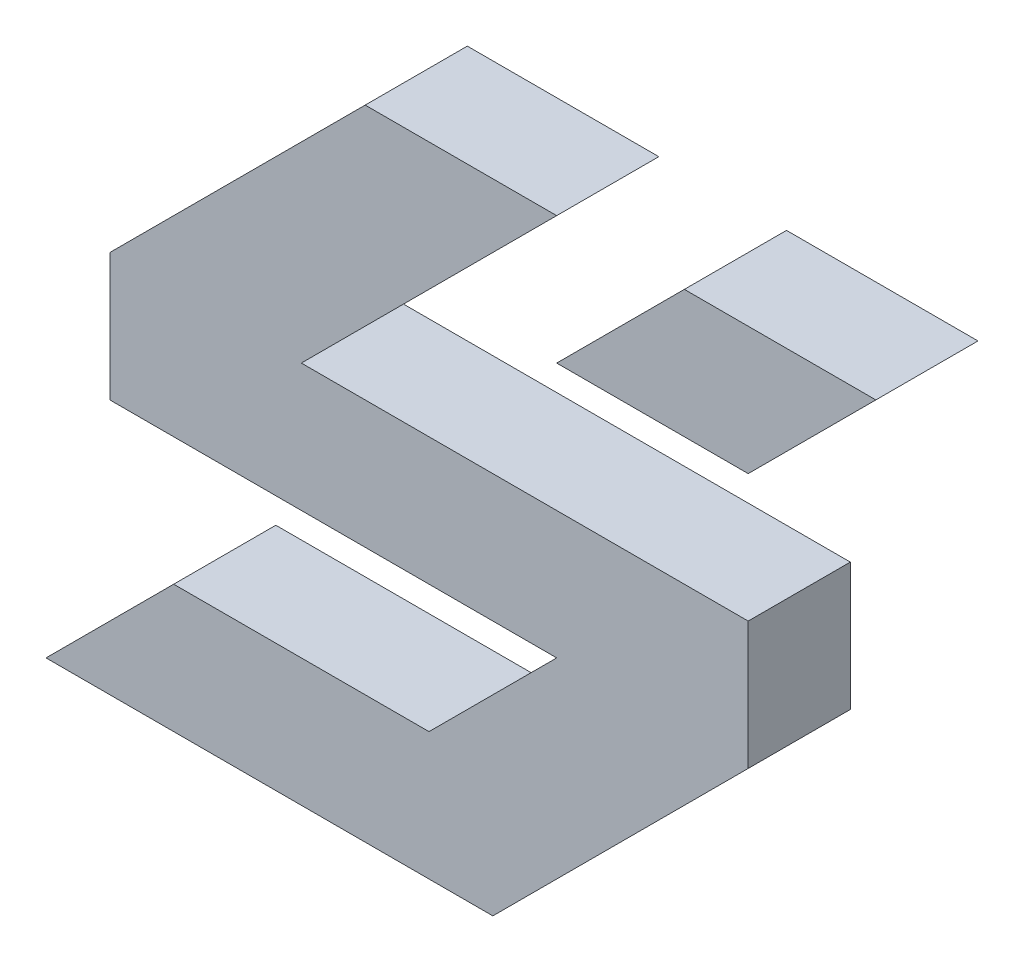
ISO-10303-21;
HEADER;
FILE_DESCRIPTION(('STEP AP214'),'2;1');
FILE_NAME('part.step','',(''),(''),'','','');
FILE_SCHEMA(('AUTOMOTIVE_DESIGN { 1 0 10303 214 1 1 1 1 }'));
ENDSEC;
DATA;
#1=APPLICATION_CONTEXT('core data for automotive mechanical design processes');
#2=APPLICATION_PROTOCOL_DEFINITION('international standard','automotive_design',2000,#1);
#3=PRODUCT_CONTEXT('',#1,'mechanical');
#4=PRODUCT('Part','Part','',(#3));
#5=PRODUCT_RELATED_PRODUCT_CATEGORY('part','',(#4));
#6=PRODUCT_DEFINITION_FORMATION('','',#4);
#7=PRODUCT_DEFINITION_CONTEXT('part definition',#1,'design');
#8=PRODUCT_DEFINITION('design','',#6,#7);
#9=PRODUCT_DEFINITION_SHAPE('','',#8);
#10=(LENGTH_UNIT() NAMED_UNIT(*) SI_UNIT(.MILLI.,.METRE.));
#11=(NAMED_UNIT(*) PLANE_ANGLE_UNIT() SI_UNIT($,.RADIAN.));
#12=(NAMED_UNIT(*) SI_UNIT($,.STERADIAN.) SOLID_ANGLE_UNIT());
#13=UNCERTAINTY_MEASURE_WITH_UNIT(LENGTH_MEASURE(1.E-05),#10,'distance_accuracy_value','');
#14=(GEOMETRIC_REPRESENTATION_CONTEXT(3) GLOBAL_UNCERTAINTY_ASSIGNED_CONTEXT((#13)) GLOBAL_UNIT_ASSIGNED_CONTEXT((#10,
#11,#12)) REPRESENTATION_CONTEXT('',''));
#15=CARTESIAN_POINT('',(0.,0.,0.));
#16=DIRECTION('',(0.,0.,1.));
#17=DIRECTION('',(1.,0.,0.));
#18=AXIS2_PLACEMENT_3D('',#15,#16,#17);
#19=CARTESIAN_POINT('',(0.,0.,10.));
#20=DIRECTION('',(-0.707106781186549,0.707106781186546,0.));
#21=DIRECTION('',(-0.707106781186546,-0.707106781186549,0.));
#22=AXIS2_PLACEMENT_3D('',#19,#20,#21);
#23=PLANE('',#22);
#24=DIRECTION('',(0.707106781186546,0.707106781186549,0.));
#25=VECTOR('',#24,1.);
#26=CARTESIAN_POINT('',(0.,0.,0.));
#27=LINE('',#26,#25);
#28=CARTESIAN_POINT('',(37.4999999999998,37.5,0.));
#29=VERTEX_POINT('',#28);
#30=CARTESIAN_POINT('',(62.4999999999998,62.5,0.));
#31=VERTEX_POINT('',#30);
#32=EDGE_CURVE('E224',#29,#31,#27,.T.);
#33=ORIENTED_EDGE('',*,*,#32,.F.);
#34=DIRECTION('',(0.,0.,-1.));
#35=VECTOR('',#34,1.);
#36=CARTESIAN_POINT('',(37.4999999999998,37.5,10.));
#37=LINE('',#36,#35);
#38=CARTESIAN_POINT('',(37.4999999999998,37.5,10.));
#39=VERTEX_POINT('',#38);
#40=EDGE_CURVE('E13',#39,#29,#37,.T.);
#41=ORIENTED_EDGE('',*,*,#40,.F.);
#42=DIRECTION('',(0.707106781186546,0.707106781186549,0.));
#43=VECTOR('',#42,1.);
#44=CARTESIAN_POINT('',(0.,0.,10.));
#45=LINE('',#44,#43);
#46=CARTESIAN_POINT('',(62.4999999999998,62.5,10.));
#47=VERTEX_POINT('',#46);
#48=EDGE_CURVE('E264',#39,#47,#45,.T.);
#49=ORIENTED_EDGE('',*,*,#48,.T.);
#50=DIRECTION('',(0.,0.,-1.));
#51=VECTOR('',#50,1.);
#52=CARTESIAN_POINT('',(62.4999999999998,62.5,10.));
#53=LINE('',#52,#51);
#54=EDGE_CURVE('E116',#47,#31,#53,.T.);
#55=ORIENTED_EDGE('',*,*,#54,.T.);
#56=EDGE_LOOP('',(#33,#41,#49,#55));
#57=FACE_BOUND('',#56,.T.);
#58=ADVANCED_FACE('F99',(#57),#23,.T.);
#59=CARTESIAN_POINT('',(37.4999999999999,0.,10.));
#60=DIRECTION('',(1.,0.,0.));
#61=DIRECTION('',(0.,0.,-1.));
#62=AXIS2_PLACEMENT_3D('',#59,#60,#61);
#63=PLANE('',#62);
#64=DIRECTION('',(0.,-1.,0.));
#65=VECTOR('',#64,1.);
#66=CARTESIAN_POINT('',(37.4999999999999,0.,0.));
#67=LINE('',#66,#65);
#68=CARTESIAN_POINT('',(37.4999999999999,25.,0.));
#69=VERTEX_POINT('',#68);
#70=EDGE_CURVE('E227',#29,#69,#67,.T.);
#71=ORIENTED_EDGE('',*,*,#70,.T.);
#72=DIRECTION('',(0.,0.,-1.));
#73=VECTOR('',#72,1.);
#74=CARTESIAN_POINT('',(37.4999999999999,25.,10.));
#75=LINE('',#74,#73);
#76=CARTESIAN_POINT('',(37.4999999999999,25.,10.));
#77=VERTEX_POINT('',#76);
#78=EDGE_CURVE('E108',#77,#69,#75,.T.);
#79=ORIENTED_EDGE('',*,*,#78,.F.);
#80=DIRECTION('',(0.,-1.,0.));
#81=VECTOR('',#80,1.);
#82=CARTESIAN_POINT('',(37.4999999999999,0.,10.));
#83=LINE('',#82,#81);
#84=EDGE_CURVE('E321',#39,#77,#83,.T.);
#85=ORIENTED_EDGE('',*,*,#84,.F.);
#86=ORIENTED_EDGE('',*,*,#40,.T.);
#87=EDGE_LOOP('',(#71,#79,#85,#86));
#88=FACE_BOUND('',#87,.T.);
#89=ADVANCED_FACE('F351',(#88),#63,.F.);
#90=CARTESIAN_POINT('',(0.,25.,10.));
#91=DIRECTION('',(0.,1.,0.));
#92=DIRECTION('',(0.,0.,1.));
#93=AXIS2_PLACEMENT_3D('',#90,#91,#92);
#94=PLANE('',#93);
#95=DIRECTION('',(1.,0.,0.));
#96=VECTOR('',#95,1.);
#97=CARTESIAN_POINT('',(0.,25.,0.));
#98=LINE('',#97,#96);
#99=CARTESIAN_POINT('',(81.2499999999999,25.,0.));
#100=VERTEX_POINT('',#99);
#101=EDGE_CURVE('E230',#69,#100,#98,.T.);
#102=ORIENTED_EDGE('',*,*,#101,.T.);
#103=DIRECTION('',(0.,0.,-1.));
#104=VECTOR('',#103,1.);
#105=CARTESIAN_POINT('',(81.2499999999999,25.,10.));
#106=LINE('',#105,#104);
#107=CARTESIAN_POINT('',(81.2499999999999,25.,10.));
#108=VERTEX_POINT('',#107);
#109=EDGE_CURVE('E289',#108,#100,#106,.T.);
#110=ORIENTED_EDGE('',*,*,#109,.F.);
#111=DIRECTION('',(1.,0.,0.));
#112=VECTOR('',#111,1.);
#113=CARTESIAN_POINT('',(0.,25.,10.));
#114=LINE('',#113,#112);
#115=EDGE_CURVE('E299',#77,#108,#114,.T.);
#116=ORIENTED_EDGE('',*,*,#115,.F.);
#117=ORIENTED_EDGE('',*,*,#78,.T.);
#118=EDGE_LOOP('',(#102,#110,#116,#117));
#119=FACE_BOUND('',#118,.T.);
#120=ADVANCED_FACE('F297',(#119),#94,.F.);
#121=CARTESIAN_POINT('',(28.1250000000001,-28.125,10.));
#122=DIRECTION('',(-0.707106781186549,0.707106781186546,0.));
#123=DIRECTION('',(-0.707106781186546,-0.707106781186549,0.));
#124=AXIS2_PLACEMENT_3D('',#121,#122,#123);
#125=PLANE('',#124);
#126=DIRECTION('',(0.707106781186546,0.707106781186549,0.));
#127=VECTOR('',#126,1.);
#128=CARTESIAN_POINT('',(28.1250000000001,-28.125,0.));
#129=LINE('',#128,#127);
#130=CARTESIAN_POINT('',(68.7499999999999,12.5,0.));
#131=VERTEX_POINT('',#130);
#132=EDGE_CURVE('E234',#131,#100,#129,.T.);
#133=ORIENTED_EDGE('',*,*,#132,.F.);
#134=DIRECTION('',(0.,0.,-1.));
#135=VECTOR('',#134,1.);
#136=CARTESIAN_POINT('',(68.7499999999999,12.5,10.));
#137=LINE('',#136,#135);
#138=CARTESIAN_POINT('',(68.7499999999999,12.5,10.));
#139=VERTEX_POINT('',#138);
#140=EDGE_CURVE('E286',#139,#131,#137,.T.);
#141=ORIENTED_EDGE('',*,*,#140,.F.);
#142=DIRECTION('',(0.707106781186546,0.707106781186549,0.));
#143=VECTOR('',#142,1.);
#144=CARTESIAN_POINT('',(28.1250000000001,-28.125,10.));
#145=LINE('',#144,#143);
#146=EDGE_CURVE('E311',#139,#108,#145,.T.);
#147=ORIENTED_EDGE('',*,*,#146,.T.);
#148=ORIENTED_EDGE('',*,*,#109,.T.);
#149=EDGE_LOOP('',(#133,#141,#147,#148));
#150=FACE_BOUND('',#149,.T.);
#151=ADVANCED_FACE('F308',(#150),#125,.T.);
#152=CARTESIAN_POINT('',(0.,12.5,10.));
#153=DIRECTION('',(0.,1.,0.));
#154=DIRECTION('',(-1.,0.,0.));
#155=AXIS2_PLACEMENT_3D('',#152,#153,#154);
#156=PLANE('',#155);
#157=DIRECTION('',(1.,0.,0.));
#158=VECTOR('',#157,1.);
#159=CARTESIAN_POINT('',(0.,12.5,0.));
#160=LINE('',#159,#158);
#161=CARTESIAN_POINT('',(43.7500000000001,12.5,0.));
#162=VERTEX_POINT('',#161);
#163=EDGE_CURVE('E238',#162,#131,#160,.T.);
#164=ORIENTED_EDGE('',*,*,#163,.F.);
#165=DIRECTION('',(0.,0.,-1.));
#166=VECTOR('',#165,1.);
#167=CARTESIAN_POINT('',(43.7500000000001,12.5,10.));
#168=LINE('',#167,#166);
#169=CARTESIAN_POINT('',(43.7500000000001,12.5,10.));
#170=VERTEX_POINT('',#169);
#171=EDGE_CURVE('E283',#170,#162,#168,.T.);
#172=ORIENTED_EDGE('',*,*,#171,.F.);
#173=DIRECTION('',(1.,0.,0.));
#174=VECTOR('',#173,1.);
#175=CARTESIAN_POINT('',(0.,12.5,10.));
#176=LINE('',#175,#174);
#177=EDGE_CURVE('E315',#170,#139,#176,.T.);
#178=ORIENTED_EDGE('',*,*,#177,.T.);
#179=ORIENTED_EDGE('',*,*,#140,.T.);
#180=EDGE_LOOP('',(#164,#172,#178,#179));
#181=FACE_BOUND('',#180,.T.);
#182=ADVANCED_FACE('F362',(#181),#156,.T.);
#183=CARTESIAN_POINT('',(15.6250000000001,-15.6250000000001,10.));
#184=DIRECTION('',(0.707106781186549,-0.707106781186546,0.));
#185=DIRECTION('',(0.707106781186546,0.707106781186549,0.));
#186=AXIS2_PLACEMENT_3D('',#183,#184,#185);
#187=PLANE('',#186);
#188=DIRECTION('',(-0.707106781186546,-0.707106781186549,0.));
#189=VECTOR('',#188,1.);
#190=CARTESIAN_POINT('',(15.6250000000001,-15.6250000000001,0.));
#191=LINE('',#190,#189);
#192=CARTESIAN_POINT('',(31.2500000000001,0.,0.));
#193=VERTEX_POINT('',#192);
#194=EDGE_CURVE('E242',#162,#193,#191,.T.);
#195=ORIENTED_EDGE('',*,*,#194,.T.);
#196=DIRECTION('',(0.,0.,-1.));
#197=VECTOR('',#196,1.);
#198=CARTESIAN_POINT('',(31.2500000000001,0.,10.));
#199=LINE('',#198,#197);
#200=CARTESIAN_POINT('',(31.2500000000001,0.,10.));
#201=VERTEX_POINT('',#200);
#202=EDGE_CURVE('E279',#201,#193,#199,.T.);
#203=ORIENTED_EDGE('',*,*,#202,.F.);
#204=DIRECTION('',(-0.707106781186546,-0.707106781186549,0.));
#205=VECTOR('',#204,1.);
#206=CARTESIAN_POINT('',(15.6250000000001,-15.6250000000001,10.));
#207=LINE('',#206,#205);
#208=EDGE_CURVE('E319',#170,#201,#207,.T.);
#209=ORIENTED_EDGE('',*,*,#208,.F.);
#210=ORIENTED_EDGE('',*,*,#171,.T.);
#211=EDGE_LOOP('',(#195,#203,#209,#210));
#212=FACE_BOUND('',#211,.T.);
#213=ADVANCED_FACE('F365',(#212),#187,.F.);
#214=CARTESIAN_POINT('',(0.,0.,10.));
#215=DIRECTION('',(0.,1.,0.));
#216=DIRECTION('',(0.,0.,1.));
#217=AXIS2_PLACEMENT_3D('',#214,#215,#216);
#218=PLANE('',#217);
#219=DIRECTION('',(1.,0.,0.));
#220=VECTOR('',#219,1.);
#221=CARTESIAN_POINT('',(0.,0.,0.));
#222=LINE('',#221,#220);
#223=CARTESIAN_POINT('',(75.,0.,0.));
#224=VERTEX_POINT('',#223);
#225=EDGE_CURVE('E245',#193,#224,#222,.T.);
#226=ORIENTED_EDGE('',*,*,#225,.T.);
#227=DIRECTION('',(0.,0.,-1.));
#228=VECTOR('',#227,1.);
#229=CARTESIAN_POINT('',(75.,0.,10.));
#230=LINE('',#229,#228);
#231=CARTESIAN_POINT('',(75.,0.,10.));
#232=VERTEX_POINT('',#231);
#233=EDGE_CURVE('E275',#232,#224,#230,.T.);
#234=ORIENTED_EDGE('',*,*,#233,.F.);
#235=DIRECTION('',(1.,0.,0.));
#236=VECTOR('',#235,1.);
#237=CARTESIAN_POINT('',(0.,0.,10.));
#238=LINE('',#237,#236);
#239=EDGE_CURVE('E327',#201,#232,#238,.T.);
#240=ORIENTED_EDGE('',*,*,#239,.F.);
#241=ORIENTED_EDGE('',*,*,#202,.T.);
#242=EDGE_LOOP('',(#226,#234,#240,#241));
#243=FACE_BOUND('',#242,.T.);
#244=ADVANCED_FACE('F369',(#243),#218,.F.);
#245=CARTESIAN_POINT('',(37.5000000000001,-37.5,10.));
#246=DIRECTION('',(-0.707106781186549,0.707106781186546,0.));
#247=DIRECTION('',(-0.707106781186546,-0.707106781186549,0.));
#248=AXIS2_PLACEMENT_3D('',#245,#246,#247);
#249=PLANE('',#248);
#250=DIRECTION('',(0.707106781186546,0.707106781186549,0.));
#251=VECTOR('',#250,1.);
#252=CARTESIAN_POINT('',(37.5000000000001,-37.5,0.));
#253=LINE('',#252,#251);
#254=CARTESIAN_POINT('',(99.9999999999999,25.,0.));
#255=VERTEX_POINT('',#254);
#256=EDGE_CURVE('E248',#224,#255,#253,.T.);
#257=ORIENTED_EDGE('',*,*,#256,.T.);
#258=DIRECTION('',(0.,0.,-1.));
#259=VECTOR('',#258,1.);
#260=CARTESIAN_POINT('',(99.9999999999999,25.,10.));
#261=LINE('',#260,#259);
#262=CARTESIAN_POINT('',(99.9999999999999,25.,10.));
#263=VERTEX_POINT('',#262);
#264=EDGE_CURVE('E271',#263,#255,#261,.T.);
#265=ORIENTED_EDGE('',*,*,#264,.F.);
#266=DIRECTION('',(0.707106781186546,0.707106781186549,0.));
#267=VECTOR('',#266,1.);
#268=CARTESIAN_POINT('',(37.5000000000001,-37.5,10.));
#269=LINE('',#268,#267);
#270=EDGE_CURVE('E218',#232,#263,#269,.T.);
#271=ORIENTED_EDGE('',*,*,#270,.F.);
#272=ORIENTED_EDGE('',*,*,#233,.T.);
#273=EDGE_LOOP('',(#257,#265,#271,#272));
#274=FACE_BOUND('',#273,.T.);
#275=ADVANCED_FACE('F335',(#274),#249,.F.);
#276=CARTESIAN_POINT('',(99.9999999999999,0.,10.));
#277=DIRECTION('',(-1.,0.,0.));
#278=DIRECTION('',(0.,0.,1.));
#279=AXIS2_PLACEMENT_3D('',#276,#277,#278);
#280=PLANE('',#279);
#281=DIRECTION('',(0.,1.,0.));
#282=VECTOR('',#281,1.);
#283=CARTESIAN_POINT('',(99.9999999999999,0.,0.));
#284=LINE('',#283,#282);
#285=CARTESIAN_POINT('',(99.9999999999999,37.5,0.));
#286=VERTEX_POINT('',#285);
#287=EDGE_CURVE('E251',#255,#286,#284,.T.);
#288=ORIENTED_EDGE('',*,*,#287,.T.);
#289=DIRECTION('',(0.,0.,-1.));
#290=VECTOR('',#289,1.);
#291=CARTESIAN_POINT('',(99.9999999999999,37.5,10.));
#292=LINE('',#291,#290);
#293=CARTESIAN_POINT('',(99.9999999999999,37.5,10.));
#294=VERTEX_POINT('',#293);
#295=EDGE_CURVE('E201',#294,#286,#292,.T.);
#296=ORIENTED_EDGE('',*,*,#295,.F.);
#297=DIRECTION('',(0.,1.,0.));
#298=VECTOR('',#297,1.);
#299=CARTESIAN_POINT('',(99.9999999999999,0.,10.));
#300=LINE('',#299,#298);
#301=EDGE_CURVE('E213',#263,#294,#300,.T.);
#302=ORIENTED_EDGE('',*,*,#301,.F.);
#303=ORIENTED_EDGE('',*,*,#264,.T.);
#304=EDGE_LOOP('',(#288,#296,#302,#303));
#305=FACE_BOUND('',#304,.T.);
#306=ADVANCED_FACE('F339',(#305),#280,.F.);
#307=CARTESIAN_POINT('',(0.,37.5,10.));
#308=DIRECTION('',(0.,1.,0.));
#309=DIRECTION('',(0.,0.,1.));
#310=AXIS2_PLACEMENT_3D('',#307,#308,#309);
#311=PLANE('',#310);
#312=DIRECTION('',(1.,0.,0.));
#313=VECTOR('',#312,1.);
#314=CARTESIAN_POINT('',(0.,37.5,0.));
#315=LINE('',#314,#313);
#316=CARTESIAN_POINT('',(56.2499999999999,37.5,0.));
#317=VERTEX_POINT('',#316);
#318=EDGE_CURVE('E197',#317,#286,#315,.T.);
#319=ORIENTED_EDGE('',*,*,#318,.F.);
#320=DIRECTION('',(0.,0.,-1.));
#321=VECTOR('',#320,1.);
#322=CARTESIAN_POINT('',(56.2499999999999,37.5,10.));
#323=LINE('',#322,#321);
#324=CARTESIAN_POINT('',(56.2499999999999,37.5,10.));
#325=VERTEX_POINT('',#324);
#326=EDGE_CURVE('E191',#325,#317,#323,.T.);
#327=ORIENTED_EDGE('',*,*,#326,.F.);
#328=DIRECTION('',(1.,0.,0.));
#329=VECTOR('',#328,1.);
#330=CARTESIAN_POINT('',(0.,37.5,10.));
#331=LINE('',#330,#329);
#332=EDGE_CURVE('E195',#325,#294,#331,.T.);
#333=ORIENTED_EDGE('',*,*,#332,.T.);
#334=ORIENTED_EDGE('',*,*,#295,.T.);
#335=EDGE_LOOP('',(#319,#327,#333,#334));
#336=FACE_BOUND('',#335,.T.);
#337=ADVANCED_FACE('F193',(#336),#311,.T.);
#338=CARTESIAN_POINT('',(9.37500000000003,-9.375,10.));
#339=DIRECTION('',(-0.707106781186549,0.707106781186546,0.));
#340=DIRECTION('',(-0.707106781186546,-0.707106781186549,0.));
#341=AXIS2_PLACEMENT_3D('',#338,#339,#340);
#342=PLANE('',#341);
#343=DIRECTION('',(0.707106781186546,0.707106781186549,0.));
#344=VECTOR('',#343,1.);
#345=CARTESIAN_POINT('',(9.37500000000003,-9.375,0.));
#346=LINE('',#345,#344);
#347=CARTESIAN_POINT('',(81.2499999999998,62.5,0.));
#348=VERTEX_POINT('',#347);
#349=EDGE_CURVE('E257',#317,#348,#346,.T.);
#350=ORIENTED_EDGE('',*,*,#349,.T.);
#351=DIRECTION('',(0.,0.,-1.));
#352=VECTOR('',#351,1.);
#353=CARTESIAN_POINT('',(81.2499999999998,62.5,10.));
#354=LINE('',#353,#352);
#355=CARTESIAN_POINT('',(81.2499999999998,62.5,10.));
#356=VERTEX_POINT('',#355);
#357=EDGE_CURVE('E154',#356,#348,#354,.T.);
#358=ORIENTED_EDGE('',*,*,#357,.F.);
#359=DIRECTION('',(0.707106781186546,0.707106781186549,0.));
#360=VECTOR('',#359,1.);
#361=CARTESIAN_POINT('',(9.37500000000003,-9.375,10.));
#362=LINE('',#361,#360);
#363=EDGE_CURVE('E203',#325,#356,#362,.T.);
#364=ORIENTED_EDGE('',*,*,#363,.F.);
#365=ORIENTED_EDGE('',*,*,#326,.T.);
#366=EDGE_LOOP('',(#350,#358,#364,#365));
#367=FACE_BOUND('',#366,.T.);
#368=ADVANCED_FACE('F204',(#367),#342,.F.);
#369=CARTESIAN_POINT('',(0.,62.5,10.));
#370=DIRECTION('',(0.,1.,0.));
#371=DIRECTION('',(0.,0.,1.));
#372=AXIS2_PLACEMENT_3D('',#369,#370,#371);
#373=PLANE('',#372);
#374=DIRECTION('',(1.,0.,0.));
#375=VECTOR('',#374,1.);
#376=CARTESIAN_POINT('',(0.,62.5,0.));
#377=LINE('',#376,#375);
#378=EDGE_CURVE('E260',#31,#348,#377,.T.);
#379=ORIENTED_EDGE('',*,*,#378,.F.);
#380=ORIENTED_EDGE('',*,*,#54,.F.);
#381=DIRECTION('',(1.,0.,0.));
#382=VECTOR('',#381,1.);
#383=CARTESIAN_POINT('',(0.,62.5,10.));
#384=LINE('',#383,#382);
#385=EDGE_CURVE('E208',#47,#356,#384,.T.);
#386=ORIENTED_EDGE('',*,*,#385,.T.);
#387=ORIENTED_EDGE('',*,*,#357,.T.);
#388=EDGE_LOOP('',(#379,#380,#386,#387));
#389=FACE_BOUND('',#388,.T.);
#390=ADVANCED_FACE('F340',(#389),#373,.T.);
#391=CARTESIAN_POINT('',(0.,0.,10.));
#392=DIRECTION('',(0.,0.,1.));
#393=DIRECTION('',(1.,0.,0.));
#394=AXIS2_PLACEMENT_3D('',#391,#392,#393);
#395=PLANE('',#394);
#396=ORIENTED_EDGE('',*,*,#48,.F.);
#397=ORIENTED_EDGE('',*,*,#84,.T.);
#398=ORIENTED_EDGE('',*,*,#115,.T.);
#399=ORIENTED_EDGE('',*,*,#146,.F.);
#400=ORIENTED_EDGE('',*,*,#177,.F.);
#401=ORIENTED_EDGE('',*,*,#208,.T.);
#402=ORIENTED_EDGE('',*,*,#239,.T.);
#403=ORIENTED_EDGE('',*,*,#270,.T.);
#404=ORIENTED_EDGE('',*,*,#301,.T.);
#405=ORIENTED_EDGE('',*,*,#332,.F.);
#406=ORIENTED_EDGE('',*,*,#363,.T.);
#407=ORIENTED_EDGE('',*,*,#385,.F.);
#408=EDGE_LOOP('',(#396,#397,#398,#399,#400,#401,#402,#403,#404,#405,#406,#407));
#409=FACE_BOUND('',#408,.T.);
#410=ADVANCED_FACE('F211',(#409),#395,.T.);
#411=CARTESIAN_POINT('',(0.,0.,0.));
#412=DIRECTION('',(0.,0.,1.));
#413=DIRECTION('',(1.,0.,0.));
#414=AXIS2_PLACEMENT_3D('',#411,#412,#413);
#415=PLANE('',#414);
#416=ORIENTED_EDGE('',*,*,#32,.T.);
#417=ORIENTED_EDGE('',*,*,#378,.T.);
#418=ORIENTED_EDGE('',*,*,#349,.F.);
#419=ORIENTED_EDGE('',*,*,#318,.T.);
#420=ORIENTED_EDGE('',*,*,#287,.F.);
#421=ORIENTED_EDGE('',*,*,#256,.F.);
#422=ORIENTED_EDGE('',*,*,#225,.F.);
#423=ORIENTED_EDGE('',*,*,#194,.F.);
#424=ORIENTED_EDGE('',*,*,#163,.T.);
#425=ORIENTED_EDGE('',*,*,#132,.T.);
#426=ORIENTED_EDGE('',*,*,#101,.F.);
#427=ORIENTED_EDGE('',*,*,#70,.F.);
#428=EDGE_LOOP('',(#416,#417,#418,#419,#420,#421,#422,#423,#424,#425,#426,#427));
#429=FACE_BOUND('',#428,.T.);
#430=ADVANCED_FACE('F303',(#429),#415,.F.);
#431=CLOSED_SHELL('',(#58,#89,#120,#151,#182,#213,#244,#275,#306,#337,#368,#390,#410,#430));
#432=MANIFOLD_SOLID_BREP('B2',#431);
#433=CARTESIAN_POINT('',(0.,50.,10.));
#434=DIRECTION('',(0.,1.,0.));
#435=DIRECTION('',(-1.,0.,0.));
#436=AXIS2_PLACEMENT_3D('',#433,#434,#435);
#437=PLANE('',#436);
#438=DIRECTION('',(1.,0.,0.));
#439=VECTOR('',#438,1.);
#440=CARTESIAN_POINT('',(0.,50.,0.));
#441=LINE('',#440,#439);
#442=CARTESIAN_POINT('',(81.2499999999999,50.,0.));
#443=VERTEX_POINT('',#442);
#444=CARTESIAN_POINT('',(99.9999999999999,50.,0.));
#445=VERTEX_POINT('',#444);
#446=EDGE_CURVE('E584',#443,#445,#441,.T.);
#447=ORIENTED_EDGE('',*,*,#446,.T.);
#448=DIRECTION('',(0.,0.,-1.));
#449=VECTOR('',#448,1.);
#450=CARTESIAN_POINT('',(99.9999999999999,50.,10.));
#451=LINE('',#450,#449);
#452=CARTESIAN_POINT('',(99.9999999999999,50.,10.));
#453=VERTEX_POINT('',#452);
#454=EDGE_CURVE('E97',#453,#445,#451,.T.);
#455=ORIENTED_EDGE('',*,*,#454,.F.);
#456=DIRECTION('',(1.,0.,0.));
#457=VECTOR('',#456,1.);
#458=CARTESIAN_POINT('',(0.,50.,10.));
#459=LINE('',#458,#457);
#460=CARTESIAN_POINT('',(81.2499999999999,50.,10.));
#461=VERTEX_POINT('',#460);
#462=EDGE_CURVE('E570',#461,#453,#459,.T.);
#463=ORIENTED_EDGE('',*,*,#462,.F.);
#464=DIRECTION('',(0.,0.,-1.));
#465=VECTOR('',#464,1.);
#466=CARTESIAN_POINT('',(81.2499999999999,50.,10.));
#467=LINE('',#466,#465);
#468=EDGE_CURVE('E537',#461,#443,#467,.T.);
#469=ORIENTED_EDGE('',*,*,#468,.T.);
#470=EDGE_LOOP('',(#447,#455,#463,#469));
#471=FACE_BOUND('',#470,.T.);
#472=ADVANCED_FACE('F521',(#471),#437,.F.);
#473=CARTESIAN_POINT('',(25.0000000000002,-25.0000000000001,10.));
#474=DIRECTION('',(-0.707106781186549,0.707106781186546,0.));
#475=DIRECTION('',(-0.707106781186546,-0.707106781186549,0.));
#476=AXIS2_PLACEMENT_3D('',#473,#474,#475);
#477=PLANE('',#476);
#478=DIRECTION('',(0.707106781186546,0.707106781186549,0.));
#479=VECTOR('',#478,1.);
#480=CARTESIAN_POINT('',(25.0000000000002,-25.0000000000001,0.));
#481=LINE('',#480,#479);
#482=CARTESIAN_POINT('',(112.5,62.5,0.));
#483=VERTEX_POINT('',#482);
#484=EDGE_CURVE('E575',#445,#483,#481,.T.);
#485=ORIENTED_EDGE('',*,*,#484,.T.);
#486=DIRECTION('',(0.,0.,-1.));
#487=VECTOR('',#486,1.);
#488=CARTESIAN_POINT('',(112.5,62.5,10.));
#489=LINE('',#488,#487);
#490=CARTESIAN_POINT('',(112.5,62.5,10.));
#491=VERTEX_POINT('',#490);
#492=EDGE_CURVE('E529',#491,#483,#489,.T.);
#493=ORIENTED_EDGE('',*,*,#492,.F.);
#494=DIRECTION('',(0.707106781186546,0.707106781186549,0.));
#495=VECTOR('',#494,1.);
#496=CARTESIAN_POINT('',(25.0000000000002,-25.0000000000001,10.));
#497=LINE('',#496,#495);
#498=EDGE_CURVE('E562',#453,#491,#497,.T.);
#499=ORIENTED_EDGE('',*,*,#498,.F.);
#500=ORIENTED_EDGE('',*,*,#454,.T.);
#501=EDGE_LOOP('',(#485,#493,#499,#500));
#502=FACE_BOUND('',#501,.T.);
#503=ADVANCED_FACE('F574',(#502),#477,.F.);
#504=CARTESIAN_POINT('',(0.,62.5,10.));
#505=DIRECTION('',(0.,1.,0.));
#506=DIRECTION('',(0.,0.,1.));
#507=AXIS2_PLACEMENT_3D('',#504,#505,#506);
#508=PLANE('',#507);
#509=DIRECTION('',(1.,0.,0.));
#510=VECTOR('',#509,1.);
#511=CARTESIAN_POINT('',(0.,62.5,0.));
#512=LINE('',#511,#510);
#513=CARTESIAN_POINT('',(93.7499999999999,62.5,0.));
#514=VERTEX_POINT('',#513);
#515=EDGE_CURVE('E587',#514,#483,#512,.T.);
#516=ORIENTED_EDGE('',*,*,#515,.F.);
#517=DIRECTION('',(0.,0.,-1.));
#518=VECTOR('',#517,1.);
#519=CARTESIAN_POINT('',(93.7499999999999,62.5,10.));
#520=LINE('',#519,#518);
#521=CARTESIAN_POINT('',(93.7499999999999,62.5,10.));
#522=VERTEX_POINT('',#521);
#523=EDGE_CURVE('E551',#522,#514,#520,.T.);
#524=ORIENTED_EDGE('',*,*,#523,.F.);
#525=DIRECTION('',(1.,0.,0.));
#526=VECTOR('',#525,1.);
#527=CARTESIAN_POINT('',(0.,62.5,10.));
#528=LINE('',#527,#526);
#529=EDGE_CURVE('E569',#522,#491,#528,.T.);
#530=ORIENTED_EDGE('',*,*,#529,.T.);
#531=ORIENTED_EDGE('',*,*,#492,.T.);
#532=EDGE_LOOP('',(#516,#524,#530,#531));
#533=FACE_BOUND('',#532,.T.);
#534=ADVANCED_FACE('F578',(#533),#508,.T.);
#535=CARTESIAN_POINT('',(15.6250000000002,-15.6250000000001,10.));
#536=DIRECTION('',(-0.707106781186549,0.707106781186546,0.));
#537=DIRECTION('',(-0.707106781186546,-0.707106781186549,0.));
#538=AXIS2_PLACEMENT_3D('',#535,#536,#537);
#539=PLANE('',#538);
#540=DIRECTION('',(0.707106781186546,0.707106781186549,0.));
#541=VECTOR('',#540,1.);
#542=CARTESIAN_POINT('',(15.6250000000002,-15.6250000000001,0.));
#543=LINE('',#542,#541);
#544=EDGE_CURVE('E589',#443,#514,#543,.T.);
#545=ORIENTED_EDGE('',*,*,#544,.F.);
#546=ORIENTED_EDGE('',*,*,#468,.F.);
#547=DIRECTION('',(0.707106781186546,0.707106781186549,0.));
#548=VECTOR('',#547,1.);
#549=CARTESIAN_POINT('',(15.6250000000002,-15.6250000000001,10.));
#550=LINE('',#549,#548);
#551=EDGE_CURVE('E579',#461,#522,#550,.T.);
#552=ORIENTED_EDGE('',*,*,#551,.T.);
#553=ORIENTED_EDGE('',*,*,#523,.T.);
#554=EDGE_LOOP('',(#545,#546,#552,#553));
#555=FACE_BOUND('',#554,.T.);
#556=ADVANCED_FACE('F595',(#555),#539,.T.);
#557=CARTESIAN_POINT('',(0.,0.,10.));
#558=DIRECTION('',(0.,0.,1.));
#559=DIRECTION('',(1.,0.,0.));
#560=AXIS2_PLACEMENT_3D('',#557,#558,#559);
#561=PLANE('',#560);
#562=ORIENTED_EDGE('',*,*,#462,.T.);
#563=ORIENTED_EDGE('',*,*,#498,.T.);
#564=ORIENTED_EDGE('',*,*,#529,.F.);
#565=ORIENTED_EDGE('',*,*,#551,.F.);
#566=EDGE_LOOP('',(#562,#563,#564,#565));
#567=FACE_BOUND('',#566,.T.);
#568=ADVANCED_FACE('F566',(#567),#561,.T.);
#569=CARTESIAN_POINT('',(0.,0.,0.));
#570=DIRECTION('',(0.,0.,1.));
#571=DIRECTION('',(1.,0.,0.));
#572=AXIS2_PLACEMENT_3D('',#569,#570,#571);
#573=PLANE('',#572);
#574=ORIENTED_EDGE('',*,*,#446,.F.);
#575=ORIENTED_EDGE('',*,*,#544,.T.);
#576=ORIENTED_EDGE('',*,*,#515,.T.);
#577=ORIENTED_EDGE('',*,*,#484,.F.);
#578=EDGE_LOOP('',(#574,#575,#576,#577));
#579=FACE_BOUND('',#578,.T.);
#580=ADVANCED_FACE('F594',(#579),#573,.F.);
#581=CLOSED_SHELL('',(#472,#503,#534,#556,#568,#580));
#582=MANIFOLD_SOLID_BREP('B7',#581);
#583=ADVANCED_BREP_SHAPE_REPRESENTATION('',(#18,#432,#582),#14);
#584=SHAPE_DEFINITION_REPRESENTATION(#9,#583);
ENDSEC;
END-ISO-10303-21;
